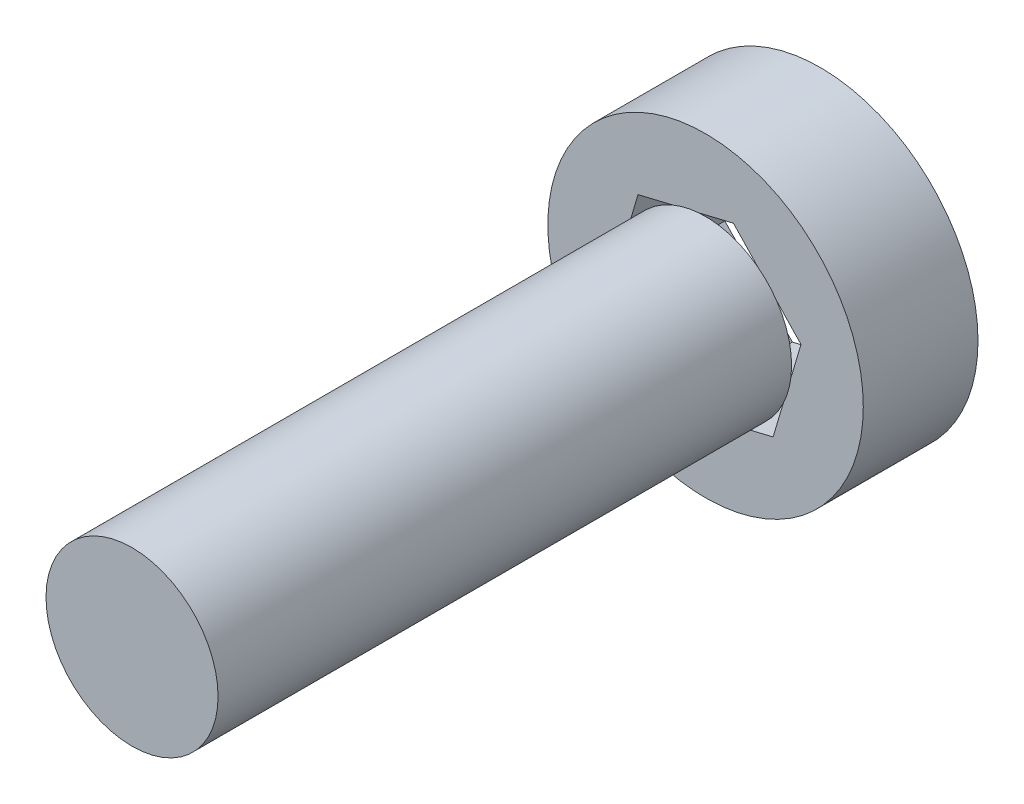
ISO-10303-21;
HEADER;
FILE_DESCRIPTION(('STEP AP214'),'2;1');
FILE_NAME('part.step','',(''),(''),'','','');
FILE_SCHEMA(('AUTOMOTIVE_DESIGN { 1 0 10303 214 1 1 1 1 }'));
ENDSEC;
DATA;
#1=APPLICATION_CONTEXT('core data for automotive mechanical design processes');
#2=APPLICATION_PROTOCOL_DEFINITION('international standard','automotive_design',2000,#1);
#3=PRODUCT_CONTEXT('',#1,'mechanical');
#4=PRODUCT('Part','Part','',(#3));
#5=PRODUCT_RELATED_PRODUCT_CATEGORY('part','',(#4));
#6=PRODUCT_DEFINITION_FORMATION('','',#4);
#7=PRODUCT_DEFINITION_CONTEXT('part definition',#1,'design');
#8=PRODUCT_DEFINITION('design','',#6,#7);
#9=PRODUCT_DEFINITION_SHAPE('','',#8);
#10=(LENGTH_UNIT() NAMED_UNIT(*) SI_UNIT(.MILLI.,.METRE.));
#11=(NAMED_UNIT(*) PLANE_ANGLE_UNIT() SI_UNIT($,.RADIAN.));
#12=(NAMED_UNIT(*) SI_UNIT($,.STERADIAN.) SOLID_ANGLE_UNIT());
#13=UNCERTAINTY_MEASURE_WITH_UNIT(LENGTH_MEASURE(1.E-05),#10,'distance_accuracy_value','');
#14=(GEOMETRIC_REPRESENTATION_CONTEXT(3) GLOBAL_UNCERTAINTY_ASSIGNED_CONTEXT((#13)) GLOBAL_UNIT_ASSIGNED_CONTEXT((#10,
#11,#12)) REPRESENTATION_CONTEXT('',''));
#15=CARTESIAN_POINT('',(0.,0.,0.));
#16=DIRECTION('',(0.,0.,1.));
#17=DIRECTION('',(1.,0.,0.));
#18=AXIS2_PLACEMENT_3D('',#15,#16,#17);
#19=CARTESIAN_POINT('',(0.,0.,2.));
#20=DIRECTION('',(0.,0.,1.));
#21=DIRECTION('',(1.,0.,0.));
#22=AXIS2_PLACEMENT_3D('',#19,#20,#21);
#23=PLANE('',#22);
#24=DIRECTION('',(-0.688236482372881,0.725486419122372,0.));
#25=VECTOR('',#24,1.);
#26=CARTESIAN_POINT('',(-0.48615590742429,-1.64025425823411,2.));
#27=LINE('',#26,#25);
#28=CARTESIAN_POINT('',(-0.48615590742429,-1.64025425823411,2.));
#29=VERTEX_POINT('',#28);
#30=CARTESIAN_POINT('',(-0.913588627341724,-1.18968727823402,2.));
#31=VERTEX_POINT('',#30);
#32=EDGE_CURVE('E156',#29,#31,#27,.T.);
#33=ORIENTED_EDGE('',*,*,#32,.T.);
#34=CARTESIAN_POINT('',(0.,0.,2.));
#35=DIRECTION('',(0.,0.,1.));
#36=DIRECTION('',(1.,0.,0.));
#37=AXIS2_PLACEMENT_3D('',#34,#35,#36);
#38=CIRCLE('',#37,1.5);
#39=CARTESIAN_POINT('',(-1.23614709009105,-0.849670743087833,2.));
#40=VERTEX_POINT('',#39);
#41=EDGE_CURVE('E151',#40,#31,#38,.T.);
#42=ORIENTED_EDGE('',*,*,#41,.F.);
#43=CARTESIAN_POINT('',(-1.66357981000848,-0.399103763087742,2.));
#44=VERTEX_POINT('',#43);
#45=EDGE_CURVE('E128',#40,#44,#27,.T.);
#46=ORIENTED_EDGE('',*,*,#45,.T.);
#47=DIRECTION('',(0.284171427874139,0.958773487107342,0.));
#48=VECTOR('',#47,1.);
#49=CARTESIAN_POINT('',(-1.66357981000848,-0.399103763087742,2.));
#50=LINE('',#49,#48);
#51=CARTESIAN_POINT('',(-1.48709371918069,0.19634732076948,2.));
#52=VERTEX_POINT('',#51);
#53=EDGE_CURVE('E138',#44,#52,#50,.T.);
#54=ORIENTED_EDGE('',*,*,#53,.T.);
#55=CARTESIAN_POINT('',(-1.35390999341199,0.645699411289145,2.));
#56=VERTEX_POINT('',#55);
#57=EDGE_CURVE('E224',#56,#52,#38,.T.);
#58=ORIENTED_EDGE('',*,*,#57,.F.);
#59=CARTESIAN_POINT('',(-1.17742390258419,1.24115049514637,2.));
#60=VERTEX_POINT('',#59);
#61=EDGE_CURVE('E147',#56,#60,#50,.T.);
#62=ORIENTED_EDGE('',*,*,#61,.T.);
#63=DIRECTION('',(0.97240791024702,0.23328706798497,0.));
#64=VECTOR('',#63,1.);
#65=CARTESIAN_POINT('',(-1.17742390258419,1.24115049514637,2.));
#66=LINE('',#65,#64);
#67=CARTESIAN_POINT('',(-0.573505091838959,1.3860345990035,2.));
#68=VERTEX_POINT('',#67);
#69=EDGE_CURVE('E165',#60,#68,#66,.T.);
#70=ORIENTED_EDGE('',*,*,#69,.T.);
#71=CARTESIAN_POINT('',(-0.117762903320943,1.49537015437698,2.));
#72=VERTEX_POINT('',#71);
#73=EDGE_CURVE('E212',#72,#68,#38,.T.);
#74=ORIENTED_EDGE('',*,*,#73,.F.);
#75=CARTESIAN_POINT('',(0.486155907424292,1.64025425823411,2.));
#76=VERTEX_POINT('',#75);
#77=EDGE_CURVE('E145',#72,#76,#66,.T.);
#78=ORIENTED_EDGE('',*,*,#77,.T.);
#79=DIRECTION('',(0.688236482372881,-0.725486419122372,0.));
#80=VECTOR('',#79,1.);
#81=CARTESIAN_POINT('',(0.486155907424292,1.64025425823411,2.));
#82=LINE('',#81,#80);
#83=CARTESIAN_POINT('',(0.913588627341729,1.18968727823401,2.));
#84=VERTEX_POINT('',#83);
#85=EDGE_CURVE('E169',#76,#84,#82,.T.);
#86=ORIENTED_EDGE('',*,*,#85,.T.);
#87=CARTESIAN_POINT('',(1.23614709009105,0.849670743087837,2.));
#88=VERTEX_POINT('',#87);
#89=EDGE_CURVE('E205',#88,#84,#38,.T.);
#90=ORIENTED_EDGE('',*,*,#89,.F.);
#91=CARTESIAN_POINT('',(1.66357981000848,0.399103763087743,2.));
#92=VERTEX_POINT('',#91);
#93=EDGE_CURVE('E167',#88,#92,#82,.T.);
#94=ORIENTED_EDGE('',*,*,#93,.T.);
#95=DIRECTION('',(-0.284171427874138,-0.958773487107342,0.));
#96=VECTOR('',#95,1.);
#97=CARTESIAN_POINT('',(1.66357981000848,0.399103763087743,2.));
#98=LINE('',#97,#96);
#99=CARTESIAN_POINT('',(1.48709371918069,-0.196347320769482,2.));
#100=VERTEX_POINT('',#99);
#101=EDGE_CURVE('E174',#92,#100,#98,.T.);
#102=ORIENTED_EDGE('',*,*,#101,.T.);
#103=CARTESIAN_POINT('',(1.35390999341199,-0.645699411289142,2.));
#104=VERTEX_POINT('',#103);
#105=EDGE_CURVE('E213',#104,#100,#38,.T.);
#106=ORIENTED_EDGE('',*,*,#105,.F.);
#107=CARTESIAN_POINT('',(1.17742390258419,-1.24115049514637,2.));
#108=VERTEX_POINT('',#107);
#109=EDGE_CURVE('E172',#104,#108,#98,.T.);
#110=ORIENTED_EDGE('',*,*,#109,.T.);
#111=DIRECTION('',(-0.97240791024702,-0.23328706798497,0.));
#112=VECTOR('',#111,1.);
#113=CARTESIAN_POINT('',(1.17742390258419,-1.24115049514637,2.));
#114=LINE('',#113,#112);
#115=CARTESIAN_POINT('',(0.573505091838959,-1.3860345990035,2.));
#116=VERTEX_POINT('',#115);
#117=EDGE_CURVE('E134',#108,#116,#114,.T.);
#118=ORIENTED_EDGE('',*,*,#117,.T.);
#119=CARTESIAN_POINT('',(0.117762903320943,-1.49537015437698,2.));
#120=VERTEX_POINT('',#119);
#121=EDGE_CURVE('E218',#120,#116,#38,.T.);
#122=ORIENTED_EDGE('',*,*,#121,.F.);
#123=EDGE_CURVE('E177',#120,#29,#114,.T.);
#124=ORIENTED_EDGE('',*,*,#123,.T.);
#125=EDGE_LOOP('',(#33,#42,#46,#54,#58,#62,#70,#74,#78,#86,#90,#94,#102,#106,#110,#118,#122,#124));
#126=FACE_BOUND('',#125,.T.);
#127=CARTESIAN_POINT('',(0.,0.,2.));
#128=DIRECTION('',(0.,0.,1.));
#129=DIRECTION('',(1.,0.,0.));
#130=AXIS2_PLACEMENT_3D('',#127,#128,#129);
#131=CIRCLE('',#130,2.75);
#132=CARTESIAN_POINT('',(2.75,0.,2.));
#133=VERTEX_POINT('',#132);
#134=EDGE_CURVE('E11',#133,#133,#131,.T.);
#135=ORIENTED_EDGE('',*,*,#134,.T.);
#136=EDGE_LOOP('',(#135));
#137=FACE_BOUND('',#136,.T.);
#138=ADVANCED_FACE('F36',(#126,#137),#23,.T.);
#139=CARTESIAN_POINT('',(0.,0.,2.));
#140=DIRECTION('',(0.,0.,-1.));
#141=DIRECTION('',(-1.,0.,0.));
#142=AXIS2_PLACEMENT_3D('',#139,#140,#141);
#143=CYLINDRICAL_SURFACE('',#142,2.75);
#144=ORIENTED_EDGE('',*,*,#134,.F.);
#145=EDGE_LOOP('',(#144));
#146=FACE_BOUND('',#145,.T.);
#147=CARTESIAN_POINT('',(0.,0.,0.));
#148=DIRECTION('',(0.,0.,1.));
#149=DIRECTION('',(1.,0.,0.));
#150=AXIS2_PLACEMENT_3D('',#147,#148,#149);
#151=CIRCLE('',#150,2.75);
#152=CARTESIAN_POINT('',(2.75,0.,0.));
#153=VERTEX_POINT('',#152);
#154=EDGE_CURVE('E40',#153,#153,#151,.T.);
#155=ORIENTED_EDGE('',*,*,#154,.T.);
#156=EDGE_LOOP('',(#155));
#157=FACE_BOUND('',#156,.T.);
#158=ADVANCED_FACE('F38',(#146,#157),#143,.T.);
#159=CARTESIAN_POINT('',(0.,0.,0.));
#160=DIRECTION('',(0.,0.,1.));
#161=DIRECTION('',(1.,0.,0.));
#162=AXIS2_PLACEMENT_3D('',#159,#160,#161);
#163=PLANE('',#162);
#164=DIRECTION('',(0.284171427874139,0.958773487107342,0.));
#165=VECTOR('',#164,1.);
#166=CARTESIAN_POINT('',(-1.66357981000848,-0.399103763087742,0.));
#167=LINE('',#166,#165);
#168=CARTESIAN_POINT('',(-1.66357981000848,-0.399103763087742,0.));
#169=VERTEX_POINT('',#168);
#170=CARTESIAN_POINT('',(-1.17742390258419,1.24115049514637,0.));
#171=VERTEX_POINT('',#170);
#172=EDGE_CURVE('E182',#169,#171,#167,.T.);
#173=ORIENTED_EDGE('',*,*,#172,.F.);
#174=DIRECTION('',(-0.688236482372881,0.725486419122372,0.));
#175=VECTOR('',#174,1.);
#176=CARTESIAN_POINT('',(-0.48615590742429,-1.64025425823411,0.));
#177=LINE('',#176,#175);
#178=CARTESIAN_POINT('',(-0.48615590742429,-1.64025425823411,0.));
#179=VERTEX_POINT('',#178);
#180=EDGE_CURVE('E51',#179,#169,#177,.T.);
#181=ORIENTED_EDGE('',*,*,#180,.F.);
#182=DIRECTION('',(-0.97240791024702,-0.23328706798497,0.));
#183=VECTOR('',#182,1.);
#184=CARTESIAN_POINT('',(1.17742390258419,-1.24115049514637,0.));
#185=LINE('',#184,#183);
#186=CARTESIAN_POINT('',(1.17742390258419,-1.24115049514637,0.));
#187=VERTEX_POINT('',#186);
#188=EDGE_CURVE('E154',#187,#179,#185,.T.);
#189=ORIENTED_EDGE('',*,*,#188,.F.);
#190=DIRECTION('',(-0.284171427874138,-0.958773487107342,0.));
#191=VECTOR('',#190,1.);
#192=CARTESIAN_POINT('',(1.66357981000848,0.399103763087743,0.));
#193=LINE('',#192,#191);
#194=CARTESIAN_POINT('',(1.66357981000848,0.399103763087743,0.));
#195=VERTEX_POINT('',#194);
#196=EDGE_CURVE('E158',#195,#187,#193,.T.);
#197=ORIENTED_EDGE('',*,*,#196,.F.);
#198=DIRECTION('',(0.688236482372881,-0.725486419122372,0.));
#199=VECTOR('',#198,1.);
#200=CARTESIAN_POINT('',(0.486155907424292,1.64025425823411,0.));
#201=LINE('',#200,#199);
#202=CARTESIAN_POINT('',(0.486155907424292,1.64025425823411,0.));
#203=VERTEX_POINT('',#202);
#204=EDGE_CURVE('E187',#203,#195,#201,.T.);
#205=ORIENTED_EDGE('',*,*,#204,.F.);
#206=DIRECTION('',(0.97240791024702,0.23328706798497,0.));
#207=VECTOR('',#206,1.);
#208=CARTESIAN_POINT('',(-1.17742390258419,1.24115049514637,0.));
#209=LINE('',#208,#207);
#210=EDGE_CURVE('E184',#171,#203,#209,.T.);
#211=ORIENTED_EDGE('',*,*,#210,.F.);
#212=EDGE_LOOP('',(#173,#181,#189,#197,#205,#211));
#213=FACE_BOUND('',#212,.T.);
#214=ORIENTED_EDGE('',*,*,#154,.F.);
#215=EDGE_LOOP('',(#214));
#216=FACE_BOUND('',#215,.T.);
#217=ADVANCED_FACE('F241',(#213,#216),#163,.F.);
#218=CARTESIAN_POINT('',(0.,0.,12.));
#219=DIRECTION('',(0.,0.,-1.));
#220=DIRECTION('',(-1.,0.,0.));
#221=AXIS2_PLACEMENT_3D('',#218,#219,#220);
#222=CYLINDRICAL_SURFACE('',#221,1.5);
#223=CARTESIAN_POINT('',(0.,0.,12.));
#224=DIRECTION('',(0.,0.,1.));
#225=DIRECTION('',(1.,0.,0.));
#226=AXIS2_PLACEMENT_3D('',#223,#224,#225);
#227=CIRCLE('',#226,1.5);
#228=CARTESIAN_POINT('',(1.5,0.,12.));
#229=VERTEX_POINT('',#228);
#230=EDGE_CURVE('E202',#229,#229,#227,.T.);
#231=ORIENTED_EDGE('',*,*,#230,.F.);
#232=EDGE_LOOP('',(#231));
#233=FACE_BOUND('',#232,.T.);
#234=ORIENTED_EDGE('',*,*,#89,.T.);
#235=EDGE_CURVE('E207',#84,#72,#38,.T.);
#236=ORIENTED_EDGE('',*,*,#235,.T.);
#237=ORIENTED_EDGE('',*,*,#73,.T.);
#238=EDGE_CURVE('E225',#68,#56,#38,.T.);
#239=ORIENTED_EDGE('',*,*,#238,.T.);
#240=ORIENTED_EDGE('',*,*,#57,.T.);
#241=EDGE_CURVE('E223',#52,#40,#38,.T.);
#242=ORIENTED_EDGE('',*,*,#241,.T.);
#243=ORIENTED_EDGE('',*,*,#41,.T.);
#244=EDGE_CURVE('E220',#31,#120,#38,.T.);
#245=ORIENTED_EDGE('',*,*,#244,.T.);
#246=ORIENTED_EDGE('',*,*,#121,.T.);
#247=EDGE_CURVE('E215',#116,#104,#38,.T.);
#248=ORIENTED_EDGE('',*,*,#247,.T.);
#249=ORIENTED_EDGE('',*,*,#105,.T.);
#250=EDGE_CURVE('E194',#100,#88,#38,.T.);
#251=ORIENTED_EDGE('',*,*,#250,.T.);
#252=EDGE_LOOP('',(#234,#236,#237,#239,#240,#242,#243,#245,#246,#248,#249,#251));
#253=FACE_BOUND('',#252,.T.);
#254=ADVANCED_FACE('F229',(#233,#253),#222,.T.);
#255=CARTESIAN_POINT('',(0.,0.,12.));
#256=DIRECTION('',(0.,0.,1.));
#257=DIRECTION('',(1.,0.,0.));
#258=AXIS2_PLACEMENT_3D('',#255,#256,#257);
#259=PLANE('',#258);
#260=ORIENTED_EDGE('',*,*,#230,.T.);
#261=EDGE_LOOP('',(#260));
#262=FACE_BOUND('',#261,.T.);
#263=ADVANCED_FACE('F280',(#262),#259,.T.);
#264=CARTESIAN_POINT('',(0.,0.,2.));
#265=DIRECTION('',(0.,0.,-1.));
#266=DIRECTION('',(-1.,0.,0.));
#267=AXIS2_PLACEMENT_3D('',#264,#265,#266);
#268=PLANE('',#267);
#269=ORIENTED_EDGE('',*,*,#238,.F.);
#270=EDGE_CURVE('E168',#68,#72,#66,.T.);
#271=ORIENTED_EDGE('',*,*,#270,.T.);
#272=ORIENTED_EDGE('',*,*,#235,.F.);
#273=EDGE_CURVE('E173',#84,#88,#82,.T.);
#274=ORIENTED_EDGE('',*,*,#273,.T.);
#275=ORIENTED_EDGE('',*,*,#250,.F.);
#276=EDGE_CURVE('E59',#100,#104,#98,.T.);
#277=ORIENTED_EDGE('',*,*,#276,.T.);
#278=ORIENTED_EDGE('',*,*,#247,.F.);
#279=EDGE_CURVE('E180',#116,#120,#114,.T.);
#280=ORIENTED_EDGE('',*,*,#279,.T.);
#281=ORIENTED_EDGE('',*,*,#244,.F.);
#282=EDGE_CURVE('E153',#31,#40,#27,.T.);
#283=ORIENTED_EDGE('',*,*,#282,.T.);
#284=ORIENTED_EDGE('',*,*,#241,.F.);
#285=EDGE_CURVE('E141',#52,#56,#50,.T.);
#286=ORIENTED_EDGE('',*,*,#285,.T.);
#287=EDGE_LOOP('',(#269,#271,#272,#274,#275,#277,#278,#280,#281,#283,#284,#286));
#288=FACE_BOUND('',#287,.T.);
#289=ADVANCED_FACE('F236',(#288),#268,.T.);
#290=CARTESIAN_POINT('',(-0.48615590742429,-1.64025425823411,2.));
#291=DIRECTION('',(-0.725486419122372,-0.688236482372881,0.));
#292=DIRECTION('',(0.688236482372881,-0.725486419122372,0.));
#293=AXIS2_PLACEMENT_3D('',#290,#291,#292);
#294=PLANE('',#293);
#295=ORIENTED_EDGE('',*,*,#180,.T.);
#296=DIRECTION('',(0.,0.,-1.));
#297=VECTOR('',#296,1.);
#298=CARTESIAN_POINT('',(-1.66357981000848,-0.399103763087742,2.));
#299=LINE('',#298,#297);
#300=EDGE_CURVE('E123',#44,#169,#299,.T.);
#301=ORIENTED_EDGE('',*,*,#300,.F.);
#302=ORIENTED_EDGE('',*,*,#45,.F.);
#303=ORIENTED_EDGE('',*,*,#282,.F.);
#304=ORIENTED_EDGE('',*,*,#32,.F.);
#305=DIRECTION('',(0.,0.,-1.));
#306=VECTOR('',#305,1.);
#307=CARTESIAN_POINT('',(-0.48615590742429,-1.64025425823411,2.));
#308=LINE('',#307,#306);
#309=EDGE_CURVE('E192',#29,#179,#308,.T.);
#310=ORIENTED_EDGE('',*,*,#309,.T.);
#311=EDGE_LOOP('',(#295,#301,#302,#303,#304,#310));
#312=FACE_BOUND('',#311,.T.);
#313=ADVANCED_FACE('F125',(#312),#294,.F.);
#314=CARTESIAN_POINT('',(1.17742390258419,-1.24115049514637,2.));
#315=DIRECTION('',(0.23328706798497,-0.97240791024702,0.));
#316=DIRECTION('',(0.97240791024702,0.23328706798497,0.));
#317=AXIS2_PLACEMENT_3D('',#314,#315,#316);
#318=PLANE('',#317);
#319=ORIENTED_EDGE('',*,*,#188,.T.);
#320=ORIENTED_EDGE('',*,*,#309,.F.);
#321=ORIENTED_EDGE('',*,*,#123,.F.);
#322=ORIENTED_EDGE('',*,*,#279,.F.);
#323=ORIENTED_EDGE('',*,*,#117,.F.);
#324=DIRECTION('',(0.,0.,-1.));
#325=VECTOR('',#324,1.);
#326=CARTESIAN_POINT('',(1.17742390258419,-1.24115049514637,2.));
#327=LINE('',#326,#325);
#328=EDGE_CURVE('E195',#108,#187,#327,.T.);
#329=ORIENTED_EDGE('',*,*,#328,.T.);
#330=EDGE_LOOP('',(#319,#320,#321,#322,#323,#329));
#331=FACE_BOUND('',#330,.T.);
#332=ADVANCED_FACE('F256',(#331),#318,.F.);
#333=CARTESIAN_POINT('',(1.66357981000848,0.399103763087743,2.));
#334=DIRECTION('',(0.958773487107343,-0.284171427874138,0.));
#335=DIRECTION('',(0.284171427874138,0.958773487107343,0.));
#336=AXIS2_PLACEMENT_3D('',#333,#334,#335);
#337=PLANE('',#336);
#338=ORIENTED_EDGE('',*,*,#196,.T.);
#339=ORIENTED_EDGE('',*,*,#328,.F.);
#340=ORIENTED_EDGE('',*,*,#109,.F.);
#341=ORIENTED_EDGE('',*,*,#276,.F.);
#342=ORIENTED_EDGE('',*,*,#101,.F.);
#343=DIRECTION('',(0.,0.,-1.));
#344=VECTOR('',#343,1.);
#345=CARTESIAN_POINT('',(1.66357981000848,0.399103763087743,2.));
#346=LINE('',#345,#344);
#347=EDGE_CURVE('E197',#92,#195,#346,.T.);
#348=ORIENTED_EDGE('',*,*,#347,.T.);
#349=EDGE_LOOP('',(#338,#339,#340,#341,#342,#348));
#350=FACE_BOUND('',#349,.T.);
#351=ADVANCED_FACE('F251',(#350),#337,.F.);
#352=CARTESIAN_POINT('',(0.486155907424292,1.64025425823411,2.));
#353=DIRECTION('',(0.725486419122372,0.688236482372881,0.));
#354=DIRECTION('',(-0.688236482372881,0.725486419122372,0.));
#355=AXIS2_PLACEMENT_3D('',#352,#353,#354);
#356=PLANE('',#355);
#357=ORIENTED_EDGE('',*,*,#204,.T.);
#358=ORIENTED_EDGE('',*,*,#347,.F.);
#359=ORIENTED_EDGE('',*,*,#93,.F.);
#360=ORIENTED_EDGE('',*,*,#273,.F.);
#361=ORIENTED_EDGE('',*,*,#85,.F.);
#362=DIRECTION('',(0.,0.,-1.));
#363=VECTOR('',#362,1.);
#364=CARTESIAN_POINT('',(0.486155907424292,1.64025425823411,2.));
#365=LINE('',#364,#363);
#366=EDGE_CURVE('E199',#76,#203,#365,.T.);
#367=ORIENTED_EDGE('',*,*,#366,.T.);
#368=EDGE_LOOP('',(#357,#358,#359,#360,#361,#367));
#369=FACE_BOUND('',#368,.T.);
#370=ADVANCED_FACE('F246',(#369),#356,.F.);
#371=CARTESIAN_POINT('',(-1.17742390258419,1.24115049514637,2.));
#372=DIRECTION('',(-0.23328706798497,0.97240791024702,0.));
#373=DIRECTION('',(-0.97240791024702,-0.23328706798497,0.));
#374=AXIS2_PLACEMENT_3D('',#371,#372,#373);
#375=PLANE('',#374);
#376=ORIENTED_EDGE('',*,*,#210,.T.);
#377=ORIENTED_EDGE('',*,*,#366,.F.);
#378=ORIENTED_EDGE('',*,*,#77,.F.);
#379=ORIENTED_EDGE('',*,*,#270,.F.);
#380=ORIENTED_EDGE('',*,*,#69,.F.);
#381=DIRECTION('',(0.,0.,-1.));
#382=VECTOR('',#381,1.);
#383=CARTESIAN_POINT('',(-1.17742390258419,1.24115049514637,2.));
#384=LINE('',#383,#382);
#385=EDGE_CURVE('E133',#60,#171,#384,.T.);
#386=ORIENTED_EDGE('',*,*,#385,.T.);
#387=EDGE_LOOP('',(#376,#377,#378,#379,#380,#386));
#388=FACE_BOUND('',#387,.T.);
#389=ADVANCED_FACE('F235',(#388),#375,.F.);
#390=CARTESIAN_POINT('',(-1.66357981000848,-0.399103763087742,2.));
#391=DIRECTION('',(-0.958773487107342,0.284171427874139,0.));
#392=DIRECTION('',(-0.284171427874139,-0.958773487107342,0.));
#393=AXIS2_PLACEMENT_3D('',#390,#391,#392);
#394=PLANE('',#393);
#395=ORIENTED_EDGE('',*,*,#172,.T.);
#396=ORIENTED_EDGE('',*,*,#385,.F.);
#397=ORIENTED_EDGE('',*,*,#61,.F.);
#398=ORIENTED_EDGE('',*,*,#285,.F.);
#399=ORIENTED_EDGE('',*,*,#53,.F.);
#400=ORIENTED_EDGE('',*,*,#300,.T.);
#401=EDGE_LOOP('',(#395,#396,#397,#398,#399,#400));
#402=FACE_BOUND('',#401,.T.);
#403=ADVANCED_FACE('F139',(#402),#394,.F.);
#404=CLOSED_SHELL('',(#138,#158,#217,#254,#263,#289,#313,#332,#351,#370,#389,#403));
#405=MANIFOLD_SOLID_BREP('B2',#404);
#406=ADVANCED_BREP_SHAPE_REPRESENTATION('',(#18,#405),#14);
#407=SHAPE_DEFINITION_REPRESENTATION(#9,#406);
ENDSEC;
END-ISO-10303-21;
